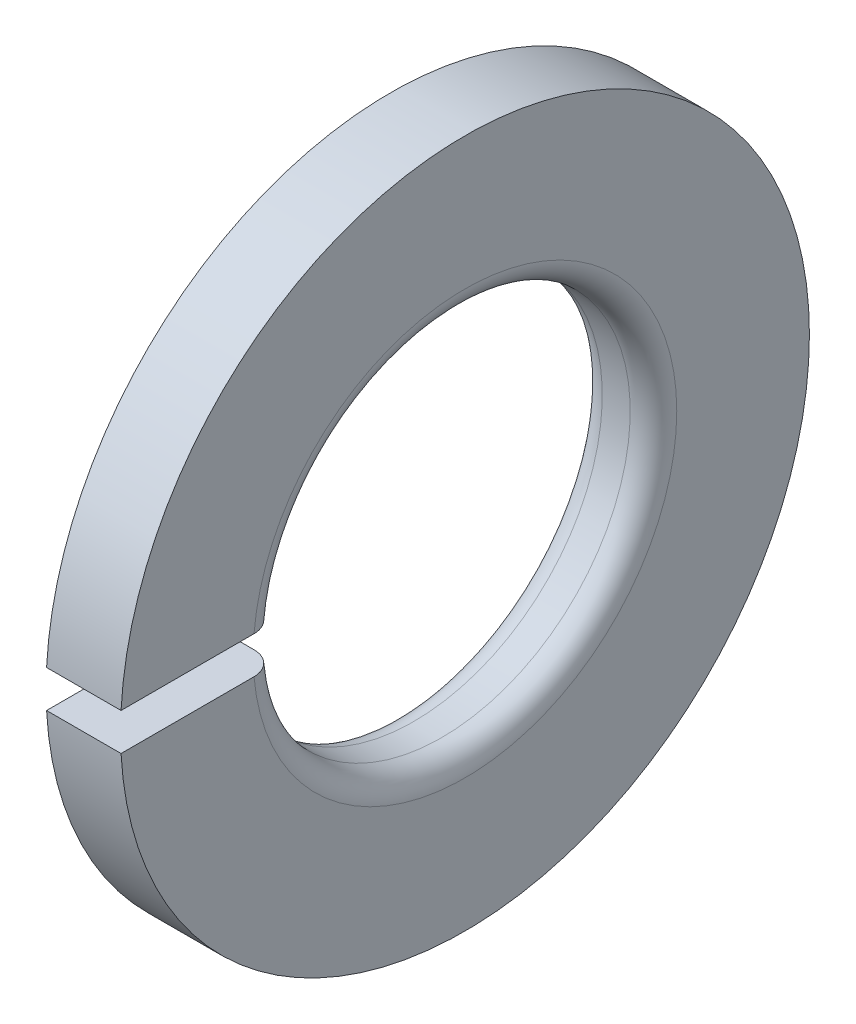
ISO-10303-21;
HEADER;
FILE_DESCRIPTION(('STEP AP214'),'2;1');
FILE_NAME('part.step','',(''),(''),'','','');
FILE_SCHEMA(('AUTOMOTIVE_DESIGN { 1 0 10303 214 1 1 1 1 }'));
ENDSEC;
DATA;
#1=APPLICATION_CONTEXT('core data for automotive mechanical design processes');
#2=APPLICATION_PROTOCOL_DEFINITION('international standard','automotive_design',2000,#1);
#3=PRODUCT_CONTEXT('',#1,'mechanical');
#4=PRODUCT('Part','Part','',(#3));
#5=PRODUCT_RELATED_PRODUCT_CATEGORY('part','',(#4));
#6=PRODUCT_DEFINITION_FORMATION('','',#4);
#7=PRODUCT_DEFINITION_CONTEXT('part definition',#1,'design');
#8=PRODUCT_DEFINITION('design','',#6,#7);
#9=PRODUCT_DEFINITION_SHAPE('','',#8);
#10=(LENGTH_UNIT() NAMED_UNIT(*) SI_UNIT(.MILLI.,.METRE.));
#11=(NAMED_UNIT(*) PLANE_ANGLE_UNIT() SI_UNIT($,.RADIAN.));
#12=(NAMED_UNIT(*) SI_UNIT($,.STERADIAN.) SOLID_ANGLE_UNIT());
#13=UNCERTAINTY_MEASURE_WITH_UNIT(LENGTH_MEASURE(1.E-05),#10,'distance_accuracy_value','');
#14=(GEOMETRIC_REPRESENTATION_CONTEXT(3) GLOBAL_UNCERTAINTY_ASSIGNED_CONTEXT((#13)) GLOBAL_UNIT_ASSIGNED_CONTEXT((#10,
#11,#12)) REPRESENTATION_CONTEXT('',''));
#15=CARTESIAN_POINT('',(0.,0.,0.));
#16=DIRECTION('',(0.,0.,1.));
#17=DIRECTION('',(1.,0.,0.));
#18=AXIS2_PLACEMENT_3D('',#15,#16,#17);
#19=CARTESIAN_POINT('',(-34.9249999999999,0.,0.));
#20=DIRECTION('',(-1.,0.,0.));
#21=DIRECTION('',(0.,0.,1.));
#22=AXIS2_PLACEMENT_3D('',#19,#20,#21);
#23=CYLINDRICAL_SURFACE('',#22,7.4);
#24=DIRECTION('',(-1.,0.,0.));
#25=VECTOR('',#24,1.);
#26=CARTESIAN_POINT('',(-34.9249999999999,0.4,7.38918128076447));
#27=LINE('',#26,#25);
#28=CARTESIAN_POINT('',(0.,0.4,7.38918128076447));
#29=VERTEX_POINT('',#28);
#30=CARTESIAN_POINT('',(-1.6,0.4,7.38918128076447));
#31=VERTEX_POINT('',#30);
#32=EDGE_CURVE('E45',#29,#31,#27,.T.);
#33=ORIENTED_EDGE('',*,*,#32,.F.);
#34=CARTESIAN_POINT('',(0.,0.,0.));
#35=DIRECTION('',(-1.,0.,0.));
#36=DIRECTION('',(0.,0.,1.));
#37=AXIS2_PLACEMENT_3D('',#34,#35,#36);
#38=CIRCLE('',#37,7.4);
#39=CARTESIAN_POINT('',(0.,-0.4,7.38918128076447));
#40=VERTEX_POINT('',#39);
#41=EDGE_CURVE('E106',#29,#40,#38,.T.);
#42=ORIENTED_EDGE('',*,*,#41,.T.);
#43=DIRECTION('',(-1.,0.,0.));
#44=VECTOR('',#43,1.);
#45=CARTESIAN_POINT('',(-34.9249999999999,-0.4,7.38918128076447));
#46=LINE('',#45,#44);
#47=CARTESIAN_POINT('',(-1.6,-0.4,7.38918128076447));
#48=VERTEX_POINT('',#47);
#49=EDGE_CURVE('E87',#48,#40,#46,.F.);
#50=ORIENTED_EDGE('',*,*,#49,.F.);
#51=CARTESIAN_POINT('',(-1.6,0.,0.));
#52=DIRECTION('',(-1.,0.,0.));
#53=DIRECTION('',(0.,0.,1.));
#54=AXIS2_PLACEMENT_3D('',#51,#52,#53);
#55=CIRCLE('',#54,7.4);
#56=EDGE_CURVE('E118',#31,#48,#55,.T.);
#57=ORIENTED_EDGE('',*,*,#56,.F.);
#58=EDGE_LOOP('',(#33,#42,#50,#57));
#59=FACE_BOUND('',#58,.T.);
#60=ADVANCED_FACE('F32',(#59),#23,.T.);
#61=CARTESIAN_POINT('',(0.,4.55,0.));
#62=DIRECTION('',(-1.,0.,0.));
#63=DIRECTION('',(0.,0.,1.));
#64=AXIS2_PLACEMENT_3D('',#61,#62,#63);
#65=PLANE('',#64);
#66=DIRECTION('',(0.,0.,-1.));
#67=VECTOR('',#66,1.);
#68=CARTESIAN_POINT('',(0.,0.4,7.548));
#69=LINE('',#68,#67);
#70=CARTESIAN_POINT('',(0.,0.4,4.53238347892144));
#71=VERTEX_POINT('',#70);
#72=EDGE_CURVE('E92',#29,#71,#69,.T.);
#73=ORIENTED_EDGE('',*,*,#72,.T.);
#74=CARTESIAN_POINT('',(0.,0.,0.));
#75=DIRECTION('',(-1.,0.,0.));
#76=DIRECTION('',(0.,0.,1.));
#77=AXIS2_PLACEMENT_3D('',#74,#75,#76);
#78=CIRCLE('',#77,4.55);
#79=CARTESIAN_POINT('',(0.,-0.4,4.53238347892144));
#80=VERTEX_POINT('',#79);
#81=EDGE_CURVE('E99',#71,#80,#78,.T.);
#82=ORIENTED_EDGE('',*,*,#81,.T.);
#83=DIRECTION('',(0.,0.,1.));
#84=VECTOR('',#83,1.);
#85=CARTESIAN_POINT('',(0.,-0.4,0.));
#86=LINE('',#85,#84);
#87=EDGE_CURVE('E81',#80,#40,#86,.T.);
#88=ORIENTED_EDGE('',*,*,#87,.T.);
#89=ORIENTED_EDGE('',*,*,#41,.F.);
#90=EDGE_LOOP('',(#73,#82,#88,#89));
#91=FACE_BOUND('',#90,.T.);
#92=ADVANCED_FACE('F105',(#91),#65,.F.);
#93=CARTESIAN_POINT('',(-0.5,0.,0.));
#94=DIRECTION('',(-1.,0.,0.));
#95=DIRECTION('',(0.,0.,1.));
#96=AXIS2_PLACEMENT_3D('',#93,#94,#95);
#97=TOROIDAL_SURFACE('',#96,4.55,0.5);
#98=ORIENTED_EDGE('',*,*,#81,.F.);
#99=CARTESIAN_POINT('',(-0.330409125838496,0.4,4.05998263665104));
#100=CARTESIAN_POINT('',(-0.356699409802159,0.4,4.05045896546519));
#101=CARTESIAN_POINT('',(-0.383811711798044,0.4,4.04314572293566));
#102=CARTESIAN_POINT('',(-0.43890146098871,0.4,4.0331697398659));
#103=CARTESIAN_POINT('',(-0.466879878970336,0.4,4.03051242528307));
#104=CARTESIAN_POINT('',(-0.522875623236477,0.4,4.02993732111437));
#105=CARTESIAN_POINT('',(-0.550892926944124,0.4,4.0320174436259));
#106=CARTESIAN_POINT('',(-0.606172773373836,0.4,4.04085230185842));
#107=CARTESIAN_POINT('',(-0.633435494454911,0.4,4.04760592293035));
#108=CARTESIAN_POINT('',(-0.686443389534875,0.4,4.06558912296167));
#109=CARTESIAN_POINT('',(-0.712188500806993,0.4,4.07681888678301));
#110=CARTESIAN_POINT('',(-0.761436770280327,0.4,4.10342912146012));
#111=CARTESIAN_POINT('',(-0.784939816128899,0.4,4.11880980017559));
#112=CARTESIAN_POINT('',(-0.829113401635915,0.4,4.1533315445104));
#113=CARTESIAN_POINT('',(-0.849775233099519,0.4,4.17248375181437));
#114=CARTESIAN_POINT('',(-0.8876079993901,0.4,4.21397126810758));
#115=CARTESIAN_POINT('',(-0.904778856858649,0.4,4.23630664761585));
#116=CARTESIAN_POINT('',(-0.93522366186201,0.4,4.28363431668716));
#117=CARTESIAN_POINT('',(-0.948479748233086,0.4,4.30863809632867));
#118=CARTESIAN_POINT('',(-0.970623347165132,0.4,4.36051051838905));
#119=CARTESIAN_POINT('',(-0.979510773610079,0.4,4.38737919755733));
#120=CARTESIAN_POINT('',(-0.992694264359639,0.4,4.44232245499124));
#121=CARTESIAN_POINT('',(-0.996973767275238,0.4,4.4704010082818));
#122=CARTESIAN_POINT('',(-1.00076411779775,0.4,4.52687835917837));
#123=CARTESIAN_POINT('',(-1.0002749143816,0.4,4.55527716020764));
#124=CARTESIAN_POINT('',(-0.994535929857931,0.4,4.61162260838542));
#125=CARTESIAN_POINT('',(-0.989280734484618,0.4,4.63956870449156));
#126=CARTESIAN_POINT('',(-0.974146548364489,0.4,4.69417974747741));
#127=CARTESIAN_POINT('',(-0.96426758016463,0.4,4.72084470060369));
#128=CARTESIAN_POINT('',(-0.940178144680579,0.4,4.77209438903105));
#129=CARTESIAN_POINT('',(-0.925973856767072,0.4,4.79668202848444));
#130=CARTESIAN_POINT('',(-0.893627088301774,0.4,4.84311401411131));
#131=CARTESIAN_POINT('',(-0.875484665198156,0.4,4.8649584002951));
#132=CARTESIAN_POINT('',(-0.835834730910519,0.4,4.90521248540847));
#133=CARTESIAN_POINT('',(-0.814337571269793,0.4,4.92363238021008));
#134=CARTESIAN_POINT('',(-0.768547265482411,0.4,4.95658736556711));
#135=CARTESIAN_POINT('',(-0.744254170003799,0.4,4.97112252650597));
#136=CARTESIAN_POINT('',(-0.693647642203833,0.4,4.99584577571264));
#137=CARTESIAN_POINT('',(-0.667341118278676,0.4,5.00604800566675));
#138=CARTESIAN_POINT('',(-0.613386245709937,0.4,5.02187927836142));
#139=CARTESIAN_POINT('',(-0.585737916867228,0.4,5.0275083885653));
#140=CARTESIAN_POINT('',(-0.529954605037797,0.4,5.03402249152879));
#141=CARTESIAN_POINT('',(-0.501820931561409,0.4,5.03491870265945));
#142=CARTESIAN_POINT('',(-0.445803103473684,0.4,5.03197138887468));
#143=CARTESIAN_POINT('',(-0.417918947108292,0.4,5.0281278973048));
#144=CARTESIAN_POINT('',(-0.363212088788793,0.4,5.01581674205707));
#145=CARTESIAN_POINT('',(-0.336388641609226,0.4,5.00735238907728));
#146=CARTESIAN_POINT('',(-0.284541175591948,0.4,4.98604553307506));
#147=CARTESIAN_POINT('',(-0.259517162805086,0.4,4.97320301533127));
#148=CARTESIAN_POINT('',(-0.211946618774085,0.4,4.94349125113134));
#149=CARTESIAN_POINT('',(-0.189402955345029,0.4,4.92661741360182));
#150=CARTESIAN_POINT('',(-0.147459087564802,0.4,4.88933373674696));
#151=CARTESIAN_POINT('',(-0.128058917811818,0.4,4.86892385850807));
#152=CARTESIAN_POINT('',(-0.092896266127335,0.4,4.82509033772428));
#153=CARTESIAN_POINT('',(-0.0771436115467008,0.4,4.8016588122359));
#154=CARTESIAN_POINT('',(-0.0497804542348706,0.4,4.75249065234612));
#155=CARTESIAN_POINT('',(-0.0381700327054248,0.4,4.72675397276829));
#156=CARTESIAN_POINT('',(-0.0193802754354039,0.4,4.67361422413994));
#157=CARTESIAN_POINT('',(-0.0122158509545891,0.4,4.64620588245276));
#158=CARTESIAN_POINT('',(-0.00257598547462909,0.4,4.59057656902082));
#159=CARTESIAN_POINT('',(-0.000100635309028552,0.4,4.56235558154479));
#160=CARTESIAN_POINT('',(9.48808271510235E-05,0.4,4.50581794311798));
#161=CARTESIAN_POINT('',(-0.00219827880257787,0.4,4.47750124545325));
#162=CARTESIAN_POINT('',(-0.0115011713231038,0.4,4.42165438954942));
#163=CARTESIAN_POINT('',(-0.0185107660902212,0.4,4.39412420830133));
#164=CARTESIAN_POINT('',(-0.0370577853171436,0.4,4.3406085068411));
#165=CARTESIAN_POINT('',(-0.0485988845907608,0.4,4.31462426004425));
#166=CARTESIAN_POINT('',(-0.0758904922003888,0.4,4.26495974515588));
#167=CARTESIAN_POINT('',(-0.0916420238086196,0.4,4.2412800390537));
#168=CARTESIAN_POINT('',(-0.12688551562409,0.4,4.19694238067456));
#169=CARTESIAN_POINT('',(-0.146372741198813,0.4,4.17628066117905));
#170=CARTESIAN_POINT('',(-0.188537988578078,0.4,4.13855872224396));
#171=CARTESIAN_POINT('',(-0.211212066622337,0.4,4.12149411562195));
#172=CARTESIAN_POINT('',(-0.250142838267341,0.4,4.09706335382185));
#173=CARTESIAN_POINT('',(-0.265634721029425,0.4,4.08845497801365));
#174=CARTESIAN_POINT('',(-0.297444248453073,0.4,4.07292985605953));
#175=CARTESIAN_POINT('',(-0.313761891790982,0.4,4.06601310720213));
#176=CARTESIAN_POINT('',(-0.330409125838496,0.4,4.05998263665104));
#177=B_SPLINE_CURVE_WITH_KNOTS('',3,(#99,#100,#101,#102,#103,#104,#105,#106,#107,#108,#109,#110,
#111,#112,#113,#114,#115,#116,#117,#118,#119,#120,#121,#122,#123,#124,#125,#126,#127,#128,#129,
#130,#131,#132,#133,#134,#135,#136,#137,#138,#139,#140,#141,#142,#143,#144,#145,#146,#147,#148,
#149,#150,#151,#152,#153,#154,#155,#156,#157,#158,#159,#160,#161,#162,#163,#164,#165,#166,#167,
#168,#169,#170,#171,#172,#173,#174,#175,#176),.UNSPECIFIED.,.T.,.F.,(4,2,2,2,2,2,2,2,2,2,2,2,2,
2,2,2,2,2,2,2,2,2,2,2,2,2,2,2,2,2,2,2,2,2,2,2,2,2,4),(0.,0.0838218122114641,0.167741244452587,
0.251623698536691,0.335486153194888,0.41935207168014,0.503222190584035,0.587343895837528,
0.671467464987353,0.755969120076875,0.840472440815542,0.92527847237597,1.0100854113248,
1.09498881356329,1.17989180179064,1.26467405791255,1.34945507734295,1.43397948444925,
1.51850236004252,1.60274721209063,1.68699082132424,1.77103465836235,1.85507790412476,
1.93906101448907,2.02304440724514,2.10712390438263,2.19120432686017,2.27550871417557,
2.35981475405075,2.44440203787257,2.52899096024473,2.61381658398821,2.69863972366968,
2.78353179303787,2.8684445127323,2.95325031685702,3.03795208220452,3.0910288601044,
3.14410555292748),.UNSPECIFIED.);
#178=CARTESIAN_POINT('',(-0.5,0.4,4.03019850627733));
#179=VERTEX_POINT('',#178);
#180=EDGE_CURVE('E125',#71,#179,#177,.T.);
#181=ORIENTED_EDGE('',*,*,#180,.T.);
#182=CARTESIAN_POINT('',(-0.5,0.,0.));
#183=DIRECTION('',(-1.,0.,0.));
#184=DIRECTION('',(0.,0.,1.));
#185=AXIS2_PLACEMENT_3D('',#182,#183,#184);
#186=CIRCLE('',#185,4.05);
#187=CARTESIAN_POINT('',(-0.5,-0.4,4.03019850627733));
#188=VERTEX_POINT('',#187);
#189=EDGE_CURVE('E101',#179,#188,#186,.T.);
#190=ORIENTED_EDGE('',*,*,#189,.T.);
#191=CARTESIAN_POINT('',(-0.330409125838496,-0.4,4.05998263665104));
#192=CARTESIAN_POINT('',(-0.30399805488411,-0.4,4.06955274934155));
#193=CARTESIAN_POINT('',(-0.27837818757097,-0.4,4.08136780490128));
#194=CARTESIAN_POINT('',(-0.229468009968176,-0.4,4.10914708906317));
#195=CARTESIAN_POINT('',(-0.206180642099156,-0.4,4.12511646922172));
#196=CARTESIAN_POINT('',(-0.162628404580926,-0.4,4.16072554719721));
#197=CARTESIAN_POINT('',(-0.142361525598716,-0.4,4.18036278525764));
#198=CARTESIAN_POINT('',(-0.10540486500231,-0.4,4.22274546756492));
#199=CARTESIAN_POINT('',(-0.0887142122853112,-0.4,4.24549015267939));
#200=CARTESIAN_POINT('',(-0.059314535506746,-0.4,4.29352811412793));
#201=CARTESIAN_POINT('',(-0.0466191936025651,-0.4,4.31882976448982));
#202=CARTESIAN_POINT('',(-0.0256391123934152,-0.4,4.37120120069836));
#203=CARTESIAN_POINT('',(-0.017354637511692,-0.4,4.39827109243858));
#204=CARTESIAN_POINT('',(-0.00540643738006145,-0.4,4.45350983104987));
#205=CARTESIAN_POINT('',(-0.00175868436314155,-0.4,4.48168213385894));
#206=CARTESIAN_POINT('',(0.000760449794840956,-0.4,4.53823962205997));
#207=CARTESIAN_POINT('',(-0.000368202658190363,-0.4,4.56662480894783));
#208=CARTESIAN_POINT('',(-0.00737611087108963,-0.4,4.62283053010403));
#209=CARTESIAN_POINT('',(-0.0132599122060801,-0.4,4.6506504979666));
#210=CARTESIAN_POINT('',(-0.0296218450398956,-0.4,4.70490507320083));
#211=CARTESIAN_POINT('',(-0.0400999430071735,-0.4,4.73133969068192));
#212=CARTESIAN_POINT('',(-0.0653384525846388,-0.4,4.7820273540891));
#213=CARTESIAN_POINT('',(-0.0800921296557155,-0.4,4.80628375286178));
#214=CARTESIAN_POINT('',(-0.113474295281594,-0.4,4.85196527308252));
#215=CARTESIAN_POINT('',(-0.132102729380619,-0.4,4.87339043431384));
#216=CARTESIAN_POINT('',(-0.172644592065893,-0.4,4.91273005629593));
#217=CARTESIAN_POINT('',(-0.194547702455831,-0.4,4.93065515030455));
#218=CARTESIAN_POINT('',(-0.2410606683829,-0.4,4.96255932206532));
#219=CARTESIAN_POINT('',(-0.265670473923854,-0.4,4.97653847268718));
#220=CARTESIAN_POINT('',(-0.316811816693699,-0.4,5.00010680296152));
#221=CARTESIAN_POINT('',(-0.343336826025041,-0.4,5.00971014847012));
#222=CARTESIAN_POINT('',(-0.397624666244257,-0.4,5.02431588077914));
#223=CARTESIAN_POINT('',(-0.42538747948622,-0.4,5.0293183331471));
#224=CARTESIAN_POINT('',(-0.481295047849467,-0.4,5.03457129491467));
#225=CARTESIAN_POINT('',(-0.509438788763078,-0.4,5.03483260397834));
#226=CARTESIAN_POINT('',(-0.565370027638145,-0.4,5.03062343748659));
#227=CARTESIAN_POINT('',(-0.59315752785097,-0.4,5.02615299184982));
#228=CARTESIAN_POINT('',(-0.647570925373918,-0.4,5.01261353673065));
#229=CARTESIAN_POINT('',(-0.674197500030906,-0.4,5.00354724878462));
#230=CARTESIAN_POINT('',(-0.725553341444254,-0.4,4.98107859095187));
#231=CARTESIAN_POINT('',(-0.750282601249349,-0.4,4.96767620517974));
#232=CARTESIAN_POINT('',(-0.797176902735773,-0.4,4.93690019753364));
#233=CARTESIAN_POINT('',(-0.819338668876582,-0.4,4.91952158513653));
#234=CARTESIAN_POINT('',(-0.860439937091276,-0.4,4.88129967041418));
#235=CARTESIAN_POINT('',(-0.879379399036049,-0.4,4.86045632494711));
#236=CARTESIAN_POINT('',(-0.913555037649964,-0.4,4.81583644954741));
#237=CARTESIAN_POINT('',(-0.928780923116178,-0.4,4.79205203768353));
#238=CARTESIAN_POINT('',(-0.955038942819603,-0.4,4.74227124767216));
#239=CARTESIAN_POINT('',(-0.966071000022656,-0.4,4.71627482890426));
#240=CARTESIAN_POINT('',(-0.983666717545484,-0.4,4.66271495586838));
#241=CARTESIAN_POINT('',(-0.990215319737526,-0.4,4.63514655445191));
#242=CARTESIAN_POINT('',(-0.998605003886776,-0.4,4.57930250605778));
#243=CARTESIAN_POINT('',(-1.00044600981623,-0.4,4.55102684766536));
#244=CARTESIAN_POINT('',(-0.99937012314289,-0.4,4.49448976015598));
#245=CARTESIAN_POINT('',(-0.996440401198442,-0.4,4.46622857452431));
#246=CARTESIAN_POINT('',(-0.985881872782797,-0.4,4.41059778472303));
#247=CARTESIAN_POINT('',(-0.978253016204551,-0.4,4.38322819006377));
#248=CARTESIAN_POINT('',(-0.958501856157753,-0.4,4.33013753544724));
#249=CARTESIAN_POINT('',(-0.946376172913595,-0.4,4.30441773255737));
#250=CARTESIAN_POINT('',(-0.917971024976107,-0.4,4.25538396733509));
#251=CARTESIAN_POINT('',(-0.901691578202923,-0.4,4.23206999462405));
#252=CARTESIAN_POINT('',(-0.865470563103926,-0.4,4.18856023044497));
#253=CARTESIAN_POINT('',(-0.84553600454997,-0.4,4.16835860431356));
#254=CARTESIAN_POINT('',(-0.802546772637626,-0.4,4.13160624609171));
#255=CARTESIAN_POINT('',(-0.779492288690129,-0.4,4.11505529252899));
#256=CARTESIAN_POINT('',(-0.731019776813241,-0.4,4.08614782469132));
#257=CARTESIAN_POINT('',(-0.705612044343374,-0.4,4.07377404617393));
#258=CARTESIAN_POINT('',(-0.653066415191544,-0.4,4.05348603352318));
#259=CARTESIAN_POINT('',(-0.625928131435778,-0.4,4.04557280100579));
#260=CARTESIAN_POINT('',(-0.570813894403623,-0.4,4.0344647130951));
#261=CARTESIAN_POINT('',(-0.542841556597771,-0.4,4.03125186183305));
#262=CARTESIAN_POINT('',(-0.486779048283176,-0.4,4.02958609117773));
#263=CARTESIAN_POINT('',(-0.45868906530473,-0.4,4.03112731488512));
#264=CARTESIAN_POINT('',(-0.41381377518447,-0.4,4.03741323322327));
#265=CARTESIAN_POINT('',(-0.396812255840647,-0.4,4.04070793348073));
#266=CARTESIAN_POINT('',(-0.363243484125798,-0.4,4.04904542615264));
#267=CARTESIAN_POINT('',(-0.346676230525089,-0.4,4.05408821361656));
#268=CARTESIAN_POINT('',(-0.330409125838496,-0.4,4.05998263665104));
#269=B_SPLINE_CURVE_WITH_KNOTS('',3,(#191,#192,#193,#194,#195,#196,#197,#198,#199,#200,#201,
#202,#203,#204,#205,#206,#207,#208,#209,#210,#211,#212,#213,#214,#215,#216,#217,#218,#219,#220,
#221,#222,#223,#224,#225,#226,#227,#228,#229,#230,#231,#232,#233,#234,#235,#236,#237,#238,#239,
#240,#241,#242,#243,#244,#245,#246,#247,#248,#249,#250,#251,#252,#253,#254,#255,#256,#257,#258,
#259,#260,#261,#262,#263,#264,#265,#266,#267,#268),.UNSPECIFIED.,.T.,.F.,(4,2,2,2,2,2,2,2,2,2,2,
2,2,2,2,2,2,2,2,2,2,2,2,2,2,2,2,2,2,2,2,2,2,2,2,2,2,2,4),(0.,0.084210958961803,
0.168526845388182,0.252786389196832,0.337025385542501,0.421549800376676,0.506079281721406,
0.59089916172813,0.675719638303083,0.760621293101301,0.845522328253754,0.930290354476798,
1.01505718945176,1.09956235176561,1.18406595342134,1.26829401209173,1.35252087040575,
1.43655584752051,1.52059029328932,1.60457503411117,1.68856008261641,1.77265112384487,
1.8567432122283,1.94106575736163,2.02538985129521,2.10999578473079,2.19460308454492,
2.2794382845123,2.36427438909627,2.44917438540744,2.53407401544967,2.61881249641859,
2.7035458352143,2.78792455681576,2.87232221812617,2.95639590139392,3.04036604940986,
3.09223340332956,3.14410061036391),.UNSPECIFIED.);
#270=EDGE_CURVE('E84',#188,#80,#269,.T.);
#271=ORIENTED_EDGE('',*,*,#270,.T.);
#272=EDGE_LOOP('',(#98,#181,#190,#271));
#273=FACE_BOUND('',#272,.T.);
#274=ADVANCED_FACE('F97',(#273),#97,.T.);
#275=CARTESIAN_POINT('',(-34.9249999999999,0.,0.));
#276=DIRECTION('',(-1.,0.,0.));
#277=DIRECTION('',(0.,0.,1.));
#278=AXIS2_PLACEMENT_3D('',#275,#276,#277);
#279=CYLINDRICAL_SURFACE('',#278,4.05);
#280=DIRECTION('',(-1.,0.,0.));
#281=VECTOR('',#280,1.);
#282=CARTESIAN_POINT('',(-34.9249999999999,0.4,4.03019850627733));
#283=LINE('',#282,#281);
#284=CARTESIAN_POINT('',(-1.1,0.4,4.03019850627733));
#285=VERTEX_POINT('',#284);
#286=EDGE_CURVE('E133',#285,#179,#283,.F.);
#287=ORIENTED_EDGE('',*,*,#286,.F.);
#288=CARTESIAN_POINT('',(-1.1,0.,0.));
#289=DIRECTION('',(-1.,0.,0.));
#290=DIRECTION('',(0.,0.,1.));
#291=AXIS2_PLACEMENT_3D('',#288,#289,#290);
#292=CIRCLE('',#291,4.05);
#293=CARTESIAN_POINT('',(-1.1,-0.4,4.03019850627733));
#294=VERTEX_POINT('',#293);
#295=EDGE_CURVE('E109',#285,#294,#292,.T.);
#296=ORIENTED_EDGE('',*,*,#295,.T.);
#297=DIRECTION('',(-1.,0.,0.));
#298=VECTOR('',#297,1.);
#299=CARTESIAN_POINT('',(-34.9249999999999,-0.4,4.03019850627733));
#300=LINE('',#299,#298);
#301=EDGE_CURVE('E102',#188,#294,#300,.T.);
#302=ORIENTED_EDGE('',*,*,#301,.F.);
#303=ORIENTED_EDGE('',*,*,#189,.F.);
#304=EDGE_LOOP('',(#287,#296,#302,#303));
#305=FACE_BOUND('',#304,.T.);
#306=ADVANCED_FACE('F132',(#305),#279,.F.);
#307=CARTESIAN_POINT('',(-1.1,0.,0.));
#308=DIRECTION('',(-1.,0.,0.));
#309=DIRECTION('',(0.,0.,1.));
#310=AXIS2_PLACEMENT_3D('',#307,#308,#309);
#311=TOROIDAL_SURFACE('',#310,4.55,0.5);
#312=ORIENTED_EDGE('',*,*,#295,.F.);
#313=CARTESIAN_POINT('',(-1.2695908741615,0.4,4.05998263665104));
#314=CARTESIAN_POINT('',(-1.29600194511589,0.4,4.06955274934155));
#315=CARTESIAN_POINT('',(-1.32162181242903,0.4,4.08136780490128));
#316=CARTESIAN_POINT('',(-1.37053199003182,0.4,4.10914708906317));
#317=CARTESIAN_POINT('',(-1.39381935790084,0.4,4.12511646922172));
#318=CARTESIAN_POINT('',(-1.43737159541907,0.4,4.16072554719721));
#319=CARTESIAN_POINT('',(-1.45763847440128,0.4,4.18036278525764));
#320=CARTESIAN_POINT('',(-1.49459513499769,0.4,4.22274546756492));
#321=CARTESIAN_POINT('',(-1.51128578771469,0.4,4.24549015267939));
#322=CARTESIAN_POINT('',(-1.54068546449325,0.4,4.29352811412793));
#323=CARTESIAN_POINT('',(-1.55338080639743,0.4,4.31882976448982));
#324=CARTESIAN_POINT('',(-1.57436088760658,0.4,4.37120120069836));
#325=CARTESIAN_POINT('',(-1.58264536248831,0.4,4.39827109243858));
#326=CARTESIAN_POINT('',(-1.59459356261994,0.4,4.45350983104987));
#327=CARTESIAN_POINT('',(-1.59824131563686,0.4,4.48168213385894));
#328=CARTESIAN_POINT('',(-1.60076044979484,0.4,4.53823962205997));
#329=CARTESIAN_POINT('',(-1.59963179734181,0.4,4.56662480894783));
#330=CARTESIAN_POINT('',(-1.59262388912891,0.4,4.62283053010403));
#331=CARTESIAN_POINT('',(-1.58674008779392,0.4,4.6506504979666));
#332=CARTESIAN_POINT('',(-1.5703781549601,0.4,4.70490507320083));
#333=CARTESIAN_POINT('',(-1.55990005699283,0.4,4.73133969068192));
#334=CARTESIAN_POINT('',(-1.53466154741536,0.4,4.7820273540891));
#335=CARTESIAN_POINT('',(-1.51990787034428,0.4,4.80628375286177));
#336=CARTESIAN_POINT('',(-1.48652570471841,0.4,4.85196527308252));
#337=CARTESIAN_POINT('',(-1.46789727061938,0.4,4.87339043431384));
#338=CARTESIAN_POINT('',(-1.42735540793411,0.4,4.91273005629593));
#339=CARTESIAN_POINT('',(-1.40545229754417,0.4,4.93065515030455));
#340=CARTESIAN_POINT('',(-1.3589393316171,0.4,4.96255932206532));
#341=CARTESIAN_POINT('',(-1.33432952607615,0.4,4.97653847268718));
#342=CARTESIAN_POINT('',(-1.2831881833063,0.4,5.00010680296152));
#343=CARTESIAN_POINT('',(-1.25666317397496,0.4,5.00971014847012));
#344=CARTESIAN_POINT('',(-1.20237533375574,0.4,5.02431588077914));
#345=CARTESIAN_POINT('',(-1.17461252051378,0.4,5.0293183331471));
#346=CARTESIAN_POINT('',(-1.11870495215053,0.4,5.03457129491467));
#347=CARTESIAN_POINT('',(-1.09056121123692,0.4,5.03483260397834));
#348=CARTESIAN_POINT('',(-1.03462997236186,0.4,5.03062343748659));
#349=CARTESIAN_POINT('',(-1.00684247214903,0.4,5.02615299184982));
#350=CARTESIAN_POINT('',(-0.952429074626083,0.4,5.01261353673065));
#351=CARTESIAN_POINT('',(-0.925802499969094,0.4,5.00354724878462));
#352=CARTESIAN_POINT('',(-0.874446658555746,0.4,4.98107859095187));
#353=CARTESIAN_POINT('',(-0.849717398750651,0.4,4.96767620517974));
#354=CARTESIAN_POINT('',(-0.802823097264228,0.4,4.93690019753364));
#355=CARTESIAN_POINT('',(-0.780661331123419,0.4,4.91952158513653));
#356=CARTESIAN_POINT('',(-0.739560062908725,0.4,4.88129967041418));
#357=CARTESIAN_POINT('',(-0.720620600963952,0.4,4.86045632494711));
#358=CARTESIAN_POINT('',(-0.686444962350037,0.4,4.81583644954741));
#359=CARTESIAN_POINT('',(-0.671219076883822,0.4,4.79205203768353));
#360=CARTESIAN_POINT('',(-0.644961057180397,0.4,4.74227124767216));
#361=CARTESIAN_POINT('',(-0.633928999977344,0.4,4.71627482890426));
#362=CARTESIAN_POINT('',(-0.616333282454516,0.4,4.66271495586838));
#363=CARTESIAN_POINT('',(-0.609784680262474,0.4,4.63514655445191));
#364=CARTESIAN_POINT('',(-0.601394996113223,0.4,4.57930250605778));
#365=CARTESIAN_POINT('',(-0.59955399018377,0.4,4.55102684766536));
#366=CARTESIAN_POINT('',(-0.600629876857109,0.4,4.49448976015598));
#367=CARTESIAN_POINT('',(-0.603559598801557,0.4,4.46622857452431));
#368=CARTESIAN_POINT('',(-0.614118127217202,0.4,4.41059778472303));
#369=CARTESIAN_POINT('',(-0.621746983795448,0.4,4.38322819006378));
#370=CARTESIAN_POINT('',(-0.641498143842247,0.4,4.33013753544724));
#371=CARTESIAN_POINT('',(-0.653623827086405,0.4,4.30441773255737));
#372=CARTESIAN_POINT('',(-0.682028975023892,0.4,4.25538396733509));
#373=CARTESIAN_POINT('',(-0.698308421797076,0.4,4.23206999462406));
#374=CARTESIAN_POINT('',(-0.734529436896073,0.4,4.18856023044497));
#375=CARTESIAN_POINT('',(-0.754463995450029,0.4,4.16835860431356));
#376=CARTESIAN_POINT('',(-0.797453227362373,0.4,4.13160624609172));
#377=CARTESIAN_POINT('',(-0.820507711309869,0.4,4.11505529252899));
#378=CARTESIAN_POINT('',(-0.868980223186757,0.4,4.08614782469132));
#379=CARTESIAN_POINT('',(-0.894387955656625,0.4,4.07377404617393));
#380=CARTESIAN_POINT('',(-0.946933584808454,0.4,4.05348603352318));
#381=CARTESIAN_POINT('',(-0.97407186856422,0.4,4.0455728010058));
#382=CARTESIAN_POINT('',(-1.02918610559638,0.4,4.0344647130951));
#383=CARTESIAN_POINT('',(-1.05715844340223,0.4,4.03125186183305));
#384=CARTESIAN_POINT('',(-1.11322095171682,0.4,4.02958609117773));
#385=CARTESIAN_POINT('',(-1.14131093469527,0.4,4.03112731488512));
#386=CARTESIAN_POINT('',(-1.18618622481553,0.4,4.03741323322327));
#387=CARTESIAN_POINT('',(-1.20318774415935,0.4,4.04070793348073));
#388=CARTESIAN_POINT('',(-1.2367565158742,0.4,4.04904542615264));
#389=CARTESIAN_POINT('',(-1.25332376947491,0.4,4.05408821361656));
#390=CARTESIAN_POINT('',(-1.2695908741615,0.4,4.05998263665104));
#391=B_SPLINE_CURVE_WITH_KNOTS('',3,(#313,#314,#315,#316,#317,#318,#319,#320,#321,#322,#323,
#324,#325,#326,#327,#328,#329,#330,#331,#332,#333,#334,#335,#336,#337,#338,#339,#340,#341,#342,
#343,#344,#345,#346,#347,#348,#349,#350,#351,#352,#353,#354,#355,#356,#357,#358,#359,#360,#361,
#362,#363,#364,#365,#366,#367,#368,#369,#370,#371,#372,#373,#374,#375,#376,#377,#378,#379,#380,
#381,#382,#383,#384,#385,#386,#387,#388,#389,#390),.UNSPECIFIED.,.T.,.F.,(4,2,2,2,2,2,2,2,2,2,2,
2,2,2,2,2,2,2,2,2,2,2,2,2,2,2,2,2,2,2,2,2,2,2,2,2,2,2,4),(0.,0.0842109589618022,
0.168526845388181,0.252786389196829,0.337025385542499,0.421549800376674,0.506079281721405,
0.590899161728128,0.675719638303082,0.760621293101299,0.845522328253752,0.930290354476796,
1.01505718945176,1.0995623517656,1.18406595342133,1.26829401209173,1.35252087040575,
1.43655584752051,1.52059029328932,1.60457503411117,1.6885600826164,1.77265112384487,
1.8567432122283,1.94106575736162,2.02538985129521,2.10999578473079,2.19460308454492,
2.2794382845123,2.36427438909626,2.44917438540744,2.53407401544967,2.61881249641859,
2.70354583521429,2.78792455681576,2.87232221812616,2.95639590139392,3.04036604940985,
3.09223340332956,3.14410061036391),.UNSPECIFIED.);
#392=CARTESIAN_POINT('',(-1.6,0.4,4.53238347892144));
#393=VERTEX_POINT('',#392);
#394=EDGE_CURVE('E119',#285,#393,#391,.T.);
#395=ORIENTED_EDGE('',*,*,#394,.T.);
#396=CARTESIAN_POINT('',(-1.6,0.,0.));
#397=DIRECTION('',(-1.,0.,0.));
#398=DIRECTION('',(0.,0.,1.));
#399=AXIS2_PLACEMENT_3D('',#396,#397,#398);
#400=CIRCLE('',#399,4.55);
#401=CARTESIAN_POINT('',(-1.6,-0.4,4.53238347892144));
#402=VERTEX_POINT('',#401);
#403=EDGE_CURVE('E122',#393,#402,#400,.T.);
#404=ORIENTED_EDGE('',*,*,#403,.T.);
#405=CARTESIAN_POINT('',(-1.2695908741615,-0.4,4.05998263665104));
#406=CARTESIAN_POINT('',(-1.24330059019784,-0.4,4.05045896546519));
#407=CARTESIAN_POINT('',(-1.21618828820196,-0.4,4.04314572293566));
#408=CARTESIAN_POINT('',(-1.16109853901129,-0.4,4.0331697398659));
#409=CARTESIAN_POINT('',(-1.13312012102966,-0.4,4.03051242528307));
#410=CARTESIAN_POINT('',(-1.07712437676352,-0.4,4.02993732111437));
#411=CARTESIAN_POINT('',(-1.04910707305588,-0.4,4.0320174436259));
#412=CARTESIAN_POINT('',(-0.993827226626164,-0.4,4.04085230185842));
#413=CARTESIAN_POINT('',(-0.966564505545089,-0.4,4.04760592293036));
#414=CARTESIAN_POINT('',(-0.913556610465125,-0.4,4.06558912296167));
#415=CARTESIAN_POINT('',(-0.887811499193007,-0.4,4.07681888678301));
#416=CARTESIAN_POINT('',(-0.838563229719674,-0.4,4.10342912146012));
#417=CARTESIAN_POINT('',(-0.815060183871102,-0.4,4.11880980017559));
#418=CARTESIAN_POINT('',(-0.770886598364086,-0.4,4.1533315445104));
#419=CARTESIAN_POINT('',(-0.750224766900481,-0.4,4.17248375181437));
#420=CARTESIAN_POINT('',(-0.7123920006099,-0.4,4.21397126810758));
#421=CARTESIAN_POINT('',(-0.695221143141351,-0.4,4.23630664761585));
#422=CARTESIAN_POINT('',(-0.66477633813799,-0.4,4.28363431668716));
#423=CARTESIAN_POINT('',(-0.651520251766914,-0.4,4.30863809632867));
#424=CARTESIAN_POINT('',(-0.629376652834869,-0.4,4.36051051838905));
#425=CARTESIAN_POINT('',(-0.620489226389921,-0.4,4.38737919755733));
#426=CARTESIAN_POINT('',(-0.607305735640361,-0.4,4.44232245499124));
#427=CARTESIAN_POINT('',(-0.603026232724762,-0.4,4.4704010082818));
#428=CARTESIAN_POINT('',(-0.599235882202245,-0.4,4.52687835917837));
#429=CARTESIAN_POINT('',(-0.599725085618397,-0.4,4.55527716020764));
#430=CARTESIAN_POINT('',(-0.605464070142068,-0.4,4.61162260838542));
#431=CARTESIAN_POINT('',(-0.610719265515381,-0.4,4.63956870449155));
#432=CARTESIAN_POINT('',(-0.625853451635511,-0.4,4.69417974747741));
#433=CARTESIAN_POINT('',(-0.635732419835369,-0.4,4.72084470060369));
#434=CARTESIAN_POINT('',(-0.659821855319421,-0.4,4.77209438903105));
#435=CARTESIAN_POINT('',(-0.674026143232927,-0.4,4.79668202848444));
#436=CARTESIAN_POINT('',(-0.706372911698224,-0.4,4.84311401411131));
#437=CARTESIAN_POINT('',(-0.724515334801842,-0.4,4.8649584002951));
#438=CARTESIAN_POINT('',(-0.76416526908948,-0.4,4.90521248540847));
#439=CARTESIAN_POINT('',(-0.785662428730206,-0.4,4.92363238021007));
#440=CARTESIAN_POINT('',(-0.831452734517588,-0.4,4.95658736556711));
#441=CARTESIAN_POINT('',(-0.855745829996201,-0.4,4.97112252650597));
#442=CARTESIAN_POINT('',(-0.906352357796166,-0.4,4.99584577571264));
#443=CARTESIAN_POINT('',(-0.932658881721324,-0.4,5.00604800566675));
#444=CARTESIAN_POINT('',(-0.986613754290063,-0.4,5.02187927836142));
#445=CARTESIAN_POINT('',(-1.01426208313277,-0.4,5.0275083885653));
#446=CARTESIAN_POINT('',(-1.0700453949622,-0.4,5.03402249152879));
#447=CARTESIAN_POINT('',(-1.09817906843859,-0.4,5.03491870265945));
#448=CARTESIAN_POINT('',(-1.15419689652632,-0.4,5.03197138887468));
#449=CARTESIAN_POINT('',(-1.18208105289171,-0.4,5.0281278973048));
#450=CARTESIAN_POINT('',(-1.23678791121121,-0.4,5.01581674205707));
#451=CARTESIAN_POINT('',(-1.26361135839077,-0.4,5.00735238907728));
#452=CARTESIAN_POINT('',(-1.31545882440805,-0.4,4.98604553307506));
#453=CARTESIAN_POINT('',(-1.34048283719491,-0.4,4.97320301533127));
#454=CARTESIAN_POINT('',(-1.38805338122591,-0.4,4.94349125113134));
#455=CARTESIAN_POINT('',(-1.41059704465497,-0.4,4.92661741360182));
#456=CARTESIAN_POINT('',(-1.4525409124352,-0.4,4.88933373674696));
#457=CARTESIAN_POINT('',(-1.47194108218818,-0.4,4.86892385850807));
#458=CARTESIAN_POINT('',(-1.50710373387266,-0.4,4.82509033772428));
#459=CARTESIAN_POINT('',(-1.5228563884533,-0.4,4.8016588122359));
#460=CARTESIAN_POINT('',(-1.55021954576513,-0.4,4.75249065234612));
#461=CARTESIAN_POINT('',(-1.56182996729457,-0.4,4.72675397276829));
#462=CARTESIAN_POINT('',(-1.5806197245646,-0.4,4.67361422413994));
#463=CARTESIAN_POINT('',(-1.58778414904541,-0.4,4.64620588245276));
#464=CARTESIAN_POINT('',(-1.59742401452537,-0.4,4.59057656902082));
#465=CARTESIAN_POINT('',(-1.59989936469097,-0.4,4.56235558154479));
#466=CARTESIAN_POINT('',(-1.60009488082715,-0.4,4.50581794311798));
#467=CARTESIAN_POINT('',(-1.59780172119742,-0.4,4.47750124545325));
#468=CARTESIAN_POINT('',(-1.5884988286769,-0.4,4.42165438954942));
#469=CARTESIAN_POINT('',(-1.58148923390978,-0.4,4.39412420830133));
#470=CARTESIAN_POINT('',(-1.56294221468286,-0.4,4.3406085068411));
#471=CARTESIAN_POINT('',(-1.55140111540924,-0.4,4.31462426004425));
#472=CARTESIAN_POINT('',(-1.52410950779961,-0.4,4.26495974515588));
#473=CARTESIAN_POINT('',(-1.50835797619138,-0.4,4.2412800390537));
#474=CARTESIAN_POINT('',(-1.47311448437591,-0.4,4.19694238067456));
#475=CARTESIAN_POINT('',(-1.45362725880119,-0.4,4.17628066117905));
#476=CARTESIAN_POINT('',(-1.41146201142192,-0.4,4.13855872224396));
#477=CARTESIAN_POINT('',(-1.38878793337766,-0.4,4.12149411562195));
#478=CARTESIAN_POINT('',(-1.34985716173266,-0.4,4.09706335382185));
#479=CARTESIAN_POINT('',(-1.33436527897058,-0.4,4.08845497801365));
#480=CARTESIAN_POINT('',(-1.30255575154693,-0.4,4.07292985605954));
#481=CARTESIAN_POINT('',(-1.28623810820902,-0.4,4.06601310720213));
#482=CARTESIAN_POINT('',(-1.2695908741615,-0.4,4.05998263665104));
#483=B_SPLINE_CURVE_WITH_KNOTS('',3,(#405,#406,#407,#408,#409,#410,#411,#412,#413,#414,#415,
#416,#417,#418,#419,#420,#421,#422,#423,#424,#425,#426,#427,#428,#429,#430,#431,#432,#433,#434,
#435,#436,#437,#438,#439,#440,#441,#442,#443,#444,#445,#446,#447,#448,#449,#450,#451,#452,#453,
#454,#455,#456,#457,#458,#459,#460,#461,#462,#463,#464,#465,#466,#467,#468,#469,#470,#471,#472,
#473,#474,#475,#476,#477,#478,#479,#480,#481,#482),.UNSPECIFIED.,.T.,.F.,(4,2,2,2,2,2,2,2,2,2,2,
2,2,2,2,2,2,2,2,2,2,2,2,2,2,2,2,2,2,2,2,2,2,2,2,2,2,2,4),(0.,0.0838218122114638,
0.167741244452586,0.251623698536691,0.335486153194887,0.419352071680139,0.503222190584034,
0.587343895837527,0.671467464987352,0.755969120076873,0.84047244081554,0.925278472375969,
1.0100854113248,1.09498881356329,1.17989180179064,1.26467405791255,1.34945507734295,
1.43397948444925,1.51850236004252,1.60274721209063,1.68699082132424,1.77103465836235,
1.85507790412476,1.93906101448907,2.02304440724514,2.10712390438263,2.19120432686017,
2.27550871417557,2.35981475405075,2.44440203787257,2.52899096024473,2.61381658398821,
2.69863972366968,2.78353179303787,2.8684445127323,2.95325031685702,3.03795208220452,
3.0910288601044,3.14410555292748),.UNSPECIFIED.);
#484=EDGE_CURVE('E53',#402,#294,#483,.T.);
#485=ORIENTED_EDGE('',*,*,#484,.T.);
#486=EDGE_LOOP('',(#312,#395,#404,#485));
#487=FACE_BOUND('',#486,.T.);
#488=ADVANCED_FACE('F136',(#487),#311,.T.);
#489=CARTESIAN_POINT('',(-1.6,7.4,0.));
#490=DIRECTION('',(1.,0.,0.));
#491=DIRECTION('',(0.,0.,-1.));
#492=AXIS2_PLACEMENT_3D('',#489,#490,#491);
#493=PLANE('',#492);
#494=DIRECTION('',(0.,0.,-1.));
#495=VECTOR('',#494,1.);
#496=CARTESIAN_POINT('',(-1.6,0.4,0.));
#497=LINE('',#496,#495);
#498=EDGE_CURVE('E11',#31,#393,#497,.T.);
#499=ORIENTED_EDGE('',*,*,#498,.F.);
#500=ORIENTED_EDGE('',*,*,#56,.T.);
#501=DIRECTION('',(0.,0.,1.));
#502=VECTOR('',#501,1.);
#503=CARTESIAN_POINT('',(-1.6,-0.4,0.));
#504=LINE('',#503,#502);
#505=EDGE_CURVE('E39',#402,#48,#504,.T.);
#506=ORIENTED_EDGE('',*,*,#505,.F.);
#507=ORIENTED_EDGE('',*,*,#403,.F.);
#508=EDGE_LOOP('',(#499,#500,#506,#507));
#509=FACE_BOUND('',#508,.T.);
#510=ADVANCED_FACE('F121',(#509),#493,.F.);
#511=CARTESIAN_POINT('',(-1.6,-0.4,0.));
#512=DIRECTION('',(0.,1.,0.));
#513=DIRECTION('',(0.,0.,1.));
#514=AXIS2_PLACEMENT_3D('',#511,#512,#513);
#515=PLANE('',#514);
#516=ORIENTED_EDGE('',*,*,#49,.T.);
#517=ORIENTED_EDGE('',*,*,#87,.F.);
#518=ORIENTED_EDGE('',*,*,#270,.F.);
#519=ORIENTED_EDGE('',*,*,#301,.T.);
#520=ORIENTED_EDGE('',*,*,#484,.F.);
#521=ORIENTED_EDGE('',*,*,#505,.T.);
#522=EDGE_LOOP('',(#516,#517,#518,#519,#520,#521));
#523=FACE_BOUND('',#522,.T.);
#524=ADVANCED_FACE('F83',(#523),#515,.T.);
#525=CARTESIAN_POINT('',(-1.6,0.4,7.548));
#526=DIRECTION('',(0.,-1.,0.));
#527=DIRECTION('',(0.,0.,-1.));
#528=AXIS2_PLACEMENT_3D('',#525,#526,#527);
#529=PLANE('',#528);
#530=ORIENTED_EDGE('',*,*,#32,.T.);
#531=ORIENTED_EDGE('',*,*,#498,.T.);
#532=ORIENTED_EDGE('',*,*,#394,.F.);
#533=ORIENTED_EDGE('',*,*,#286,.T.);
#534=ORIENTED_EDGE('',*,*,#180,.F.);
#535=ORIENTED_EDGE('',*,*,#72,.F.);
#536=EDGE_LOOP('',(#530,#531,#532,#533,#534,#535));
#537=FACE_BOUND('',#536,.T.);
#538=ADVANCED_FACE('F150',(#537),#529,.T.);
#539=CLOSED_SHELL('',(#60,#92,#274,#306,#488,#510,#524,#538));
#540=MANIFOLD_SOLID_BREP('B2',#539);
#541=ADVANCED_BREP_SHAPE_REPRESENTATION('',(#18,#540),#14);
#542=SHAPE_DEFINITION_REPRESENTATION(#9,#541);
ENDSEC;
END-ISO-10303-21;
